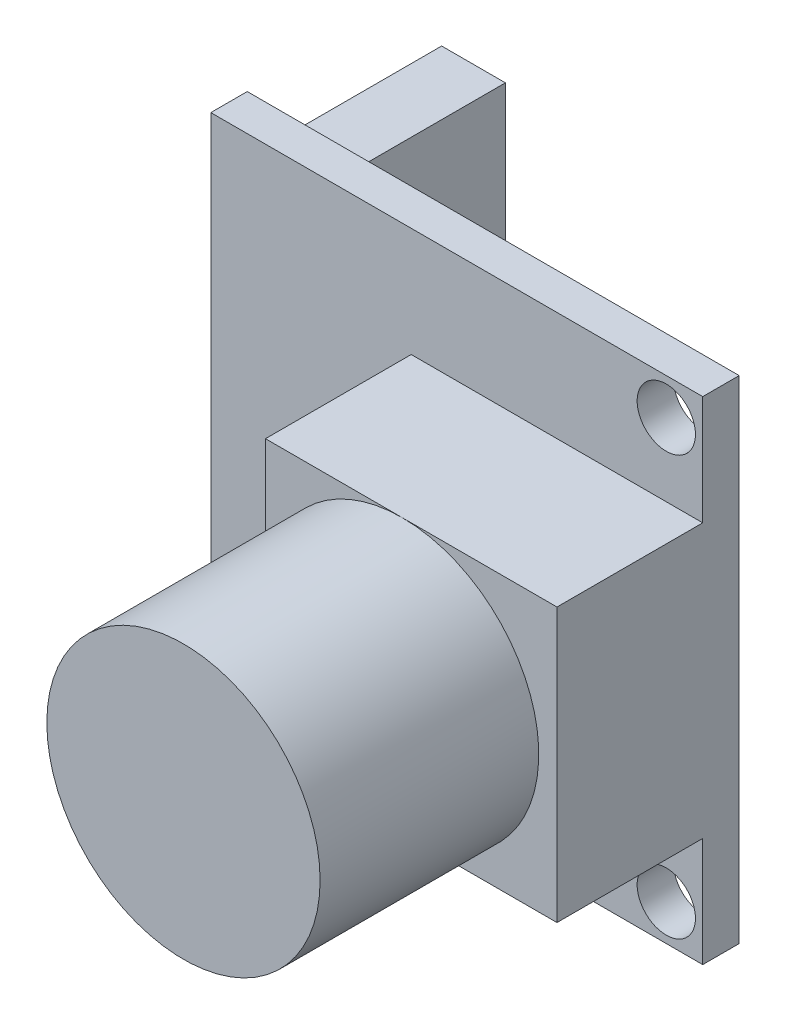
ISO-10303-21;
HEADER;
FILE_DESCRIPTION(('STEP AP214'),'2;1');
FILE_NAME('part.step','',(''),(''),'','','');
FILE_SCHEMA(('AUTOMOTIVE_DESIGN { 1 0 10303 214 1 1 1 1 }'));
ENDSEC;
DATA;
#1=APPLICATION_CONTEXT('core data for automotive mechanical design processes');
#2=APPLICATION_PROTOCOL_DEFINITION('international standard','automotive_design',2000,#1);
#3=PRODUCT_CONTEXT('',#1,'mechanical');
#4=PRODUCT('Part','Part','',(#3));
#5=PRODUCT_RELATED_PRODUCT_CATEGORY('part','',(#4));
#6=PRODUCT_DEFINITION_FORMATION('','',#4);
#7=PRODUCT_DEFINITION_CONTEXT('part definition',#1,'design');
#8=PRODUCT_DEFINITION('design','',#6,#7);
#9=PRODUCT_DEFINITION_SHAPE('','',#8);
#10=(LENGTH_UNIT() NAMED_UNIT(*) SI_UNIT(.MILLI.,.METRE.));
#11=(NAMED_UNIT(*) PLANE_ANGLE_UNIT() SI_UNIT($,.RADIAN.));
#12=(NAMED_UNIT(*) SI_UNIT($,.STERADIAN.) SOLID_ANGLE_UNIT());
#13=UNCERTAINTY_MEASURE_WITH_UNIT(LENGTH_MEASURE(1.E-05),#10,'distance_accuracy_value','');
#14=(GEOMETRIC_REPRESENTATION_CONTEXT(3) GLOBAL_UNCERTAINTY_ASSIGNED_CONTEXT((#13)) GLOBAL_UNIT_ASSIGNED_CONTEXT((#10,
#11,#12)) REPRESENTATION_CONTEXT('',''));
#15=CARTESIAN_POINT('',(0.,0.,0.));
#16=DIRECTION('',(0.,0.,1.));
#17=DIRECTION('',(1.,0.,0.));
#18=AXIS2_PLACEMENT_3D('',#15,#16,#17);
#19=CARTESIAN_POINT('',(0.,0.,0.));
#20=DIRECTION('',(0.,0.,-1.));
#21=DIRECTION('',(-1.,0.,0.));
#22=AXIS2_PLACEMENT_3D('',#19,#20,#21);
#23=PLANE('',#22);
#24=CARTESIAN_POINT('',(266.5,331.5,0.));
#25=DIRECTION('',(0.,0.,1.));
#26=DIRECTION('',(1.,0.,0.));
#27=AXIS2_PLACEMENT_3D('',#24,#25,#26);
#28=CIRCLE('',#27,1.59999999999996);
#29=CARTESIAN_POINT('',(268.1,331.5,0.));
#30=VERTEX_POINT('',#29);
#31=EDGE_CURVE('E211',#30,#30,#28,.T.);
#32=ORIENTED_EDGE('',*,*,#31,.T.);
#33=EDGE_LOOP('',(#32));
#34=FACE_BOUND('',#33,.T.);
#35=DIRECTION('',(0.,1.,0.));
#36=VECTOR('',#35,1.);
#37=CARTESIAN_POINT('',(268.5,333.5,0.));
#38=LINE('',#37,#36);
#39=CARTESIAN_POINT('',(268.5,306.5,0.));
#40=VERTEX_POINT('',#39);
#41=CARTESIAN_POINT('',(268.5,333.5,0.));
#42=VERTEX_POINT('',#41);
#43=EDGE_CURVE('E217',#40,#42,#38,.T.);
#44=ORIENTED_EDGE('',*,*,#43,.F.);
#45=DIRECTION('',(1.,0.,0.));
#46=VECTOR('',#45,1.);
#47=CARTESIAN_POINT('',(268.5,306.5,0.));
#48=LINE('',#47,#46);
#49=CARTESIAN_POINT('',(241.5,306.5,0.));
#50=VERTEX_POINT('',#49);
#51=EDGE_CURVE('E236',#50,#40,#48,.T.);
#52=ORIENTED_EDGE('',*,*,#51,.F.);
#53=DIRECTION('',(0.,-1.,0.));
#54=VECTOR('',#53,1.);
#55=CARTESIAN_POINT('',(241.5,333.5,0.));
#56=LINE('',#55,#54);
#57=CARTESIAN_POINT('',(241.5,333.5,0.));
#58=VERTEX_POINT('',#57);
#59=EDGE_CURVE('E234',#58,#50,#56,.T.);
#60=ORIENTED_EDGE('',*,*,#59,.F.);
#61=DIRECTION('',(-1.,0.,0.));
#62=VECTOR('',#61,1.);
#63=CARTESIAN_POINT('',(268.5,333.5,0.));
#64=LINE('',#63,#62);
#65=EDGE_CURVE('E232',#42,#58,#64,.T.);
#66=ORIENTED_EDGE('',*,*,#65,.F.);
#67=EDGE_LOOP('',(#44,#52,#60,#66));
#68=FACE_BOUND('',#67,.T.);
#69=CARTESIAN_POINT('',(266.5,308.5,0.));
#70=DIRECTION('',(0.,0.,1.));
#71=DIRECTION('',(1.,0.,0.));
#72=AXIS2_PLACEMENT_3D('',#69,#70,#71);
#73=CIRCLE('',#72,1.59999999999996);
#74=CARTESIAN_POINT('',(268.1,308.5,0.));
#75=VERTEX_POINT('',#74);
#76=EDGE_CURVE('E207',#75,#75,#73,.T.);
#77=ORIENTED_EDGE('',*,*,#76,.T.);
#78=EDGE_LOOP('',(#77));
#79=FACE_BOUND('',#78,.T.);
#80=DIRECTION('',(1.,0.,0.));
#81=VECTOR('',#80,1.);
#82=CARTESIAN_POINT('',(242.17,331.,0.));
#83=LINE('',#82,#81);
#84=CARTESIAN_POINT('',(242.17,331.,0.));
#85=VERTEX_POINT('',#84);
#86=CARTESIAN_POINT('',(245.67,331.,0.));
#87=VERTEX_POINT('',#86);
#88=EDGE_CURVE('E330',#85,#87,#83,.T.);
#89=ORIENTED_EDGE('',*,*,#88,.F.);
#90=DIRECTION('',(0.,1.,0.));
#91=VECTOR('',#90,1.);
#92=CARTESIAN_POINT('',(242.17,309.,0.));
#93=LINE('',#92,#91);
#94=CARTESIAN_POINT('',(242.17,309.,0.));
#95=VERTEX_POINT('',#94);
#96=EDGE_CURVE('E165',#95,#85,#93,.T.);
#97=ORIENTED_EDGE('',*,*,#96,.F.);
#98=DIRECTION('',(-1.,0.,0.));
#99=VECTOR('',#98,1.);
#100=CARTESIAN_POINT('',(242.17,309.,0.));
#101=LINE('',#100,#99);
#102=CARTESIAN_POINT('',(245.67,309.,0.));
#103=VERTEX_POINT('',#102);
#104=EDGE_CURVE('E161',#103,#95,#101,.T.);
#105=ORIENTED_EDGE('',*,*,#104,.F.);
#106=DIRECTION('',(0.,-1.,0.));
#107=VECTOR('',#106,1.);
#108=CARTESIAN_POINT('',(245.67,309.,0.));
#109=LINE('',#108,#107);
#110=EDGE_CURVE('E332',#87,#103,#109,.T.);
#111=ORIENTED_EDGE('',*,*,#110,.F.);
#112=EDGE_LOOP('',(#89,#97,#105,#111));
#113=FACE_BOUND('',#112,.T.);
#114=ADVANCED_FACE('F43',(#34,#68,#79,#113),#23,.T.);
#115=CARTESIAN_POINT('',(0.,0.,2.));
#116=DIRECTION('',(0.,0.,-1.));
#117=DIRECTION('',(-1.,0.,0.));
#118=AXIS2_PLACEMENT_3D('',#115,#116,#117);
#119=PLANE('',#118);
#120=CARTESIAN_POINT('',(266.5,308.5,2.));
#121=DIRECTION('',(0.,0.,1.));
#122=DIRECTION('',(1.,0.,0.));
#123=AXIS2_PLACEMENT_3D('',#120,#121,#122);
#124=CIRCLE('',#123,1.59999999999996);
#125=CARTESIAN_POINT('',(268.1,308.5,2.));
#126=VERTEX_POINT('',#125);
#127=EDGE_CURVE('E208',#126,#126,#124,.T.);
#128=ORIENTED_EDGE('',*,*,#127,.F.);
#129=EDGE_LOOP('',(#128));
#130=FACE_BOUND('',#129,.T.);
#131=CARTESIAN_POINT('',(266.5,331.5,2.));
#132=DIRECTION('',(0.,0.,1.));
#133=DIRECTION('',(1.,0.,0.));
#134=AXIS2_PLACEMENT_3D('',#131,#132,#133);
#135=CIRCLE('',#134,1.59999999999996);
#136=CARTESIAN_POINT('',(268.1,331.5,2.));
#137=VERTEX_POINT('',#136);
#138=EDGE_CURVE('E214',#137,#137,#135,.T.);
#139=ORIENTED_EDGE('',*,*,#138,.F.);
#140=EDGE_LOOP('',(#139));
#141=FACE_BOUND('',#140,.T.);
#142=DIRECTION('',(-1.,0.,0.));
#143=VECTOR('',#142,1.);
#144=CARTESIAN_POINT('',(268.5,327.5,2.));
#145=LINE('',#144,#143);
#146=CARTESIAN_POINT('',(268.5,327.5,2.));
#147=VERTEX_POINT('',#146);
#148=CARTESIAN_POINT('',(252.5,327.5,2.));
#149=VERTEX_POINT('',#148);
#150=EDGE_CURVE('E167',#147,#149,#145,.T.);
#151=ORIENTED_EDGE('',*,*,#150,.F.);
#152=DIRECTION('',(0.,1.,0.));
#153=VECTOR('',#152,1.);
#154=CARTESIAN_POINT('',(268.5,333.5,2.));
#155=LINE('',#154,#153);
#156=CARTESIAN_POINT('',(268.5,333.5,2.));
#157=VERTEX_POINT('',#156);
#158=EDGE_CURVE('E223',#147,#157,#155,.T.);
#159=ORIENTED_EDGE('',*,*,#158,.T.);
#160=DIRECTION('',(-1.,0.,0.));
#161=VECTOR('',#160,1.);
#162=CARTESIAN_POINT('',(268.5,333.5,2.));
#163=LINE('',#162,#161);
#164=CARTESIAN_POINT('',(241.5,333.5,2.));
#165=VERTEX_POINT('',#164);
#166=EDGE_CURVE('E222',#157,#165,#163,.T.);
#167=ORIENTED_EDGE('',*,*,#166,.T.);
#168=DIRECTION('',(0.,-1.,0.));
#169=VECTOR('',#168,1.);
#170=CARTESIAN_POINT('',(241.5,333.5,2.));
#171=LINE('',#170,#169);
#172=CARTESIAN_POINT('',(241.5,306.5,2.));
#173=VERTEX_POINT('',#172);
#174=EDGE_CURVE('E225',#165,#173,#171,.T.);
#175=ORIENTED_EDGE('',*,*,#174,.T.);
#176=DIRECTION('',(1.,0.,0.));
#177=VECTOR('',#176,1.);
#178=CARTESIAN_POINT('',(268.5,306.5,2.));
#179=LINE('',#178,#177);
#180=CARTESIAN_POINT('',(268.5,306.5,2.));
#181=VERTEX_POINT('',#180);
#182=EDGE_CURVE('E227',#173,#181,#179,.T.);
#183=ORIENTED_EDGE('',*,*,#182,.T.);
#184=CARTESIAN_POINT('',(268.5,312.5,2.));
#185=VERTEX_POINT('',#184);
#186=EDGE_CURVE('E220',#181,#185,#155,.T.);
#187=ORIENTED_EDGE('',*,*,#186,.T.);
#188=DIRECTION('',(1.,0.,0.));
#189=VECTOR('',#188,1.);
#190=CARTESIAN_POINT('',(268.5,312.5,2.));
#191=LINE('',#190,#189);
#192=CARTESIAN_POINT('',(252.5,312.5,2.));
#193=VERTEX_POINT('',#192);
#194=EDGE_CURVE('E177',#193,#185,#191,.T.);
#195=ORIENTED_EDGE('',*,*,#194,.F.);
#196=DIRECTION('',(0.,-1.,0.));
#197=VECTOR('',#196,1.);
#198=CARTESIAN_POINT('',(252.5,327.5,2.));
#199=LINE('',#198,#197);
#200=EDGE_CURVE('E67',#149,#193,#199,.T.);
#201=ORIENTED_EDGE('',*,*,#200,.F.);
#202=EDGE_LOOP('',(#151,#159,#167,#175,#183,#187,#195,#201));
#203=FACE_BOUND('',#202,.T.);
#204=ADVANCED_FACE('F294',(#130,#141,#203),#119,.F.);
#205=CARTESIAN_POINT('',(268.5,333.5,2.));
#206=DIRECTION('',(-1.,0.,0.));
#207=DIRECTION('',(0.,0.,1.));
#208=AXIS2_PLACEMENT_3D('',#205,#206,#207);
#209=PLANE('',#208);
#210=ORIENTED_EDGE('',*,*,#43,.T.);
#211=DIRECTION('',(0.,0.,-1.));
#212=VECTOR('',#211,1.);
#213=CARTESIAN_POINT('',(268.5,333.5,2.));
#214=LINE('',#213,#212);
#215=EDGE_CURVE('E245',#157,#42,#214,.T.);
#216=ORIENTED_EDGE('',*,*,#215,.F.);
#217=ORIENTED_EDGE('',*,*,#158,.F.);
#218=DIRECTION('',(0.,0.,-1.));
#219=VECTOR('',#218,1.);
#220=CARTESIAN_POINT('',(268.5,327.5,10.));
#221=LINE('',#220,#219);
#222=CARTESIAN_POINT('',(268.5,327.5,10.));
#223=VERTEX_POINT('',#222);
#224=EDGE_CURVE('E201',#223,#147,#221,.T.);
#225=ORIENTED_EDGE('',*,*,#224,.F.);
#226=DIRECTION('',(0.,1.,0.));
#227=VECTOR('',#226,1.);
#228=CARTESIAN_POINT('',(268.5,327.5,10.));
#229=LINE('',#228,#227);
#230=CARTESIAN_POINT('',(268.5,312.5,10.));
#231=VERTEX_POINT('',#230);
#232=EDGE_CURVE('E173',#231,#223,#229,.T.);
#233=ORIENTED_EDGE('',*,*,#232,.F.);
#234=DIRECTION('',(0.,0.,-1.));
#235=VECTOR('',#234,1.);
#236=CARTESIAN_POINT('',(268.5,312.5,10.));
#237=LINE('',#236,#235);
#238=EDGE_CURVE('E188',#231,#185,#237,.T.);
#239=ORIENTED_EDGE('',*,*,#238,.T.);
#240=ORIENTED_EDGE('',*,*,#186,.F.);
#241=DIRECTION('',(0.,0.,-1.));
#242=VECTOR('',#241,1.);
#243=CARTESIAN_POINT('',(268.5,306.5,2.));
#244=LINE('',#243,#242);
#245=EDGE_CURVE('E229',#181,#40,#244,.T.);
#246=ORIENTED_EDGE('',*,*,#245,.T.);
#247=EDGE_LOOP('',(#210,#216,#217,#225,#233,#239,#240,#246));
#248=FACE_BOUND('',#247,.T.);
#249=ADVANCED_FACE('F45',(#248),#209,.F.);
#250=CARTESIAN_POINT('',(268.5,333.5,2.));
#251=DIRECTION('',(0.,-1.,0.));
#252=DIRECTION('',(0.,0.,-1.));
#253=AXIS2_PLACEMENT_3D('',#250,#251,#252);
#254=PLANE('',#253);
#255=ORIENTED_EDGE('',*,*,#65,.T.);
#256=DIRECTION('',(0.,0.,-1.));
#257=VECTOR('',#256,1.);
#258=CARTESIAN_POINT('',(241.5,333.5,2.));
#259=LINE('',#258,#257);
#260=EDGE_CURVE('E243',#165,#58,#259,.T.);
#261=ORIENTED_EDGE('',*,*,#260,.F.);
#262=ORIENTED_EDGE('',*,*,#166,.F.);
#263=ORIENTED_EDGE('',*,*,#215,.T.);
#264=EDGE_LOOP('',(#255,#261,#262,#263));
#265=FACE_BOUND('',#264,.T.);
#266=ADVANCED_FACE('F312',(#265),#254,.F.);
#267=CARTESIAN_POINT('',(241.5,333.5,2.));
#268=DIRECTION('',(1.,0.,0.));
#269=DIRECTION('',(0.,0.,-1.));
#270=AXIS2_PLACEMENT_3D('',#267,#268,#269);
#271=PLANE('',#270);
#272=ORIENTED_EDGE('',*,*,#59,.T.);
#273=DIRECTION('',(0.,0.,-1.));
#274=VECTOR('',#273,1.);
#275=CARTESIAN_POINT('',(241.5,306.5,2.));
#276=LINE('',#275,#274);
#277=EDGE_CURVE('E240',#173,#50,#276,.T.);
#278=ORIENTED_EDGE('',*,*,#277,.F.);
#279=ORIENTED_EDGE('',*,*,#174,.F.);
#280=ORIENTED_EDGE('',*,*,#260,.T.);
#281=EDGE_LOOP('',(#272,#278,#279,#280));
#282=FACE_BOUND('',#281,.T.);
#283=ADVANCED_FACE('F309',(#282),#271,.F.);
#284=CARTESIAN_POINT('',(268.5,306.5,2.));
#285=DIRECTION('',(0.,1.,0.));
#286=DIRECTION('',(0.,0.,1.));
#287=AXIS2_PLACEMENT_3D('',#284,#285,#286);
#288=PLANE('',#287);
#289=ORIENTED_EDGE('',*,*,#51,.T.);
#290=ORIENTED_EDGE('',*,*,#245,.F.);
#291=ORIENTED_EDGE('',*,*,#182,.F.);
#292=ORIENTED_EDGE('',*,*,#277,.T.);
#293=EDGE_LOOP('',(#289,#290,#291,#292));
#294=FACE_BOUND('',#293,.T.);
#295=ADVANCED_FACE('F305',(#294),#288,.F.);
#296=CARTESIAN_POINT('',(266.5,331.5,2.));
#297=DIRECTION('',(0.,0.,-1.));
#298=DIRECTION('',(-1.,0.,0.));
#299=AXIS2_PLACEMENT_3D('',#296,#297,#298);
#300=CYLINDRICAL_SURFACE('',#299,1.59999999999996);
#301=ORIENTED_EDGE('',*,*,#138,.T.);
#302=EDGE_LOOP('',(#301));
#303=FACE_BOUND('',#302,.T.);
#304=ORIENTED_EDGE('',*,*,#31,.F.);
#305=EDGE_LOOP('',(#304));
#306=FACE_BOUND('',#305,.T.);
#307=ADVANCED_FACE('F308',(#303,#306),#300,.F.);
#308=CARTESIAN_POINT('',(266.5,308.5,2.));
#309=DIRECTION('',(0.,0.,-1.));
#310=DIRECTION('',(-1.,0.,0.));
#311=AXIS2_PLACEMENT_3D('',#308,#309,#310);
#312=CYLINDRICAL_SURFACE('',#311,1.59999999999996);
#313=ORIENTED_EDGE('',*,*,#127,.T.);
#314=EDGE_LOOP('',(#313));
#315=FACE_BOUND('',#314,.T.);
#316=ORIENTED_EDGE('',*,*,#76,.F.);
#317=EDGE_LOOP('',(#316));
#318=FACE_BOUND('',#317,.T.);
#319=ADVANCED_FACE('F361',(#315,#318),#312,.F.);
#320=CARTESIAN_POINT('',(268.5,327.5,10.));
#321=DIRECTION('',(0.,-1.,0.));
#322=DIRECTION('',(0.,0.,-1.));
#323=AXIS2_PLACEMENT_3D('',#320,#321,#322);
#324=PLANE('',#323);
#325=DIRECTION('',(-1.,0.,0.));
#326=VECTOR('',#325,1.);
#327=CARTESIAN_POINT('',(268.5,327.5,10.));
#328=LINE('',#327,#326);
#329=CARTESIAN_POINT('',(260.,327.5,10.));
#330=VERTEX_POINT('',#329);
#331=CARTESIAN_POINT('',(252.5,327.5,10.));
#332=VERTEX_POINT('',#331);
#333=EDGE_CURVE('E176',#330,#332,#328,.T.);
#334=ORIENTED_EDGE('',*,*,#333,.F.);
#335=EDGE_CURVE('E178',#223,#330,#328,.T.);
#336=ORIENTED_EDGE('',*,*,#335,.F.);
#337=ORIENTED_EDGE('',*,*,#224,.T.);
#338=ORIENTED_EDGE('',*,*,#150,.T.);
#339=DIRECTION('',(0.,0.,-1.));
#340=VECTOR('',#339,1.);
#341=CARTESIAN_POINT('',(252.5,327.5,10.));
#342=LINE('',#341,#340);
#343=EDGE_CURVE('E198',#332,#149,#342,.T.);
#344=ORIENTED_EDGE('',*,*,#343,.F.);
#345=EDGE_LOOP('',(#334,#336,#337,#338,#344));
#346=FACE_BOUND('',#345,.T.);
#347=ADVANCED_FACE('F274',(#346),#324,.F.);
#348=CARTESIAN_POINT('',(252.5,327.5,10.));
#349=DIRECTION('',(1.,0.,0.));
#350=DIRECTION('',(0.,0.,-1.));
#351=AXIS2_PLACEMENT_3D('',#348,#349,#350);
#352=PLANE('',#351);
#353=DIRECTION('',(0.,-1.,0.));
#354=VECTOR('',#353,1.);
#355=CARTESIAN_POINT('',(252.5,327.5,10.));
#356=LINE('',#355,#354);
#357=CARTESIAN_POINT('',(252.5,320.,10.));
#358=VERTEX_POINT('',#357);
#359=CARTESIAN_POINT('',(252.5,312.5,10.));
#360=VERTEX_POINT('',#359);
#361=EDGE_CURVE('E181',#358,#360,#356,.T.);
#362=ORIENTED_EDGE('',*,*,#361,.F.);
#363=EDGE_CURVE('E182',#332,#358,#356,.T.);
#364=ORIENTED_EDGE('',*,*,#363,.F.);
#365=ORIENTED_EDGE('',*,*,#343,.T.);
#366=ORIENTED_EDGE('',*,*,#200,.T.);
#367=DIRECTION('',(0.,0.,-1.));
#368=VECTOR('',#367,1.);
#369=CARTESIAN_POINT('',(252.5,312.5,10.));
#370=LINE('',#369,#368);
#371=EDGE_CURVE('E195',#360,#193,#370,.T.);
#372=ORIENTED_EDGE('',*,*,#371,.F.);
#373=EDGE_LOOP('',(#362,#364,#365,#366,#372));
#374=FACE_BOUND('',#373,.T.);
#375=ADVANCED_FACE('F267',(#374),#352,.F.);
#376=CARTESIAN_POINT('',(268.5,312.5,10.));
#377=DIRECTION('',(0.,1.,0.));
#378=DIRECTION('',(0.,0.,1.));
#379=AXIS2_PLACEMENT_3D('',#376,#377,#378);
#380=PLANE('',#379);
#381=DIRECTION('',(1.,0.,0.));
#382=VECTOR('',#381,1.);
#383=CARTESIAN_POINT('',(268.5,312.5,10.));
#384=LINE('',#383,#382);
#385=CARTESIAN_POINT('',(260.,312.5,10.));
#386=VERTEX_POINT('',#385);
#387=EDGE_CURVE('E185',#386,#231,#384,.T.);
#388=ORIENTED_EDGE('',*,*,#387,.F.);
#389=EDGE_CURVE('E186',#360,#386,#384,.T.);
#390=ORIENTED_EDGE('',*,*,#389,.F.);
#391=ORIENTED_EDGE('',*,*,#371,.T.);
#392=ORIENTED_EDGE('',*,*,#194,.T.);
#393=ORIENTED_EDGE('',*,*,#238,.F.);
#394=EDGE_LOOP('',(#388,#390,#391,#392,#393));
#395=FACE_BOUND('',#394,.T.);
#396=ADVANCED_FACE('F261',(#395),#380,.F.);
#397=CARTESIAN_POINT('',(0.,0.,10.));
#398=DIRECTION('',(0.,0.,-1.));
#399=DIRECTION('',(-1.,0.,0.));
#400=AXIS2_PLACEMENT_3D('',#397,#398,#399);
#401=PLANE('',#400);
#402=ORIENTED_EDGE('',*,*,#363,.T.);
#403=CARTESIAN_POINT('',(260.,320.,10.));
#404=DIRECTION('',(0.,0.,-1.));
#405=DIRECTION('',(-1.,0.,0.));
#406=AXIS2_PLACEMENT_3D('',#403,#404,#405);
#407=CIRCLE('',#406,7.50000000000001);
#408=EDGE_CURVE('E11',#358,#330,#407,.T.);
#409=ORIENTED_EDGE('',*,*,#408,.T.);
#410=ORIENTED_EDGE('',*,*,#333,.T.);
#411=EDGE_LOOP('',(#402,#409,#410));
#412=FACE_BOUND('',#411,.T.);
#413=ADVANCED_FACE('F277',(#412),#401,.F.);
#414=ORIENTED_EDGE('',*,*,#335,.T.);
#415=EDGE_CURVE('E52',#330,#386,#407,.T.);
#416=ORIENTED_EDGE('',*,*,#415,.T.);
#417=ORIENTED_EDGE('',*,*,#387,.T.);
#418=ORIENTED_EDGE('',*,*,#232,.T.);
#419=EDGE_LOOP('',(#414,#416,#417,#418));
#420=FACE_BOUND('',#419,.T.);
#421=ADVANCED_FACE('F256',(#420),#401,.F.);
#422=ORIENTED_EDGE('',*,*,#389,.T.);
#423=EDGE_CURVE('E47',#386,#358,#407,.T.);
#424=ORIENTED_EDGE('',*,*,#423,.T.);
#425=ORIENTED_EDGE('',*,*,#361,.T.);
#426=EDGE_LOOP('',(#422,#424,#425));
#427=FACE_BOUND('',#426,.T.);
#428=ADVANCED_FACE('F263',(#427),#401,.F.);
#429=CARTESIAN_POINT('',(260.,320.,22.));
#430=DIRECTION('',(0.,0.,1.));
#431=DIRECTION('',(1.,0.,0.));
#432=AXIS2_PLACEMENT_3D('',#429,#430,#431);
#433=PLANE('',#432);
#434=CARTESIAN_POINT('',(260.,320.,22.));
#435=DIRECTION('',(0.,0.,1.));
#436=DIRECTION('',(1.,0.,0.));
#437=AXIS2_PLACEMENT_3D('',#434,#435,#436);
#438=CIRCLE('',#437,7.50000000000001);
#439=CARTESIAN_POINT('',(267.5,320.,22.));
#440=VERTEX_POINT('',#439);
#441=EDGE_CURVE('E204',#440,#440,#438,.T.);
#442=ORIENTED_EDGE('',*,*,#441,.T.);
#443=EDGE_LOOP('',(#442));
#444=FACE_BOUND('',#443,.T.);
#445=ADVANCED_FACE('F280',(#444),#433,.T.);
#446=CARTESIAN_POINT('',(260.,320.,22.));
#447=DIRECTION('',(0.,0.,-1.));
#448=DIRECTION('',(-1.,0.,0.));
#449=AXIS2_PLACEMENT_3D('',#446,#447,#448);
#450=CYLINDRICAL_SURFACE('',#449,7.50000000000001);
#451=ORIENTED_EDGE('',*,*,#441,.F.);
#452=EDGE_LOOP('',(#451));
#453=FACE_BOUND('',#452,.T.);
#454=ORIENTED_EDGE('',*,*,#408,.F.);
#455=ORIENTED_EDGE('',*,*,#423,.F.);
#456=ORIENTED_EDGE('',*,*,#415,.F.);
#457=EDGE_LOOP('',(#454,#455,#456));
#458=FACE_BOUND('',#457,.T.);
#459=ADVANCED_FACE('F278',(#453,#458),#450,.T.);
#460=CARTESIAN_POINT('',(242.17,309.,-10.));
#461=DIRECTION('',(1.,0.,0.));
#462=DIRECTION('',(0.,0.,-1.));
#463=AXIS2_PLACEMENT_3D('',#460,#461,#462);
#464=PLANE('',#463);
#465=ORIENTED_EDGE('',*,*,#96,.T.);
#466=DIRECTION('',(0.,0.,1.));
#467=VECTOR('',#466,1.);
#468=CARTESIAN_POINT('',(242.17,331.,-10.));
#469=LINE('',#468,#467);
#470=CARTESIAN_POINT('',(242.17,331.,-10.));
#471=VERTEX_POINT('',#470);
#472=EDGE_CURVE('E146',#471,#85,#469,.T.);
#473=ORIENTED_EDGE('',*,*,#472,.F.);
#474=DIRECTION('',(0.,1.,0.));
#475=VECTOR('',#474,1.);
#476=CARTESIAN_POINT('',(242.17,309.,-10.));
#477=LINE('',#476,#475);
#478=CARTESIAN_POINT('',(242.17,309.,-10.));
#479=VERTEX_POINT('',#478);
#480=EDGE_CURVE('E153',#479,#471,#477,.T.);
#481=ORIENTED_EDGE('',*,*,#480,.F.);
#482=DIRECTION('',(0.,0.,1.));
#483=VECTOR('',#482,1.);
#484=CARTESIAN_POINT('',(242.17,309.,-10.));
#485=LINE('',#484,#483);
#486=EDGE_CURVE('E339',#479,#95,#485,.T.);
#487=ORIENTED_EDGE('',*,*,#486,.T.);
#488=EDGE_LOOP('',(#465,#473,#481,#487));
#489=FACE_BOUND('',#488,.T.);
#490=ADVANCED_FACE('F163',(#489),#464,.F.);
#491=CARTESIAN_POINT('',(242.17,331.,-10.));
#492=DIRECTION('',(0.,-1.,0.));
#493=DIRECTION('',(0.,0.,-1.));
#494=AXIS2_PLACEMENT_3D('',#491,#492,#493);
#495=PLANE('',#494);
#496=ORIENTED_EDGE('',*,*,#88,.T.);
#497=DIRECTION('',(0.,0.,1.));
#498=VECTOR('',#497,1.);
#499=CARTESIAN_POINT('',(245.67,331.,-10.));
#500=LINE('',#499,#498);
#501=CARTESIAN_POINT('',(245.67,331.,-10.));
#502=VERTEX_POINT('',#501);
#503=EDGE_CURVE('E149',#502,#87,#500,.T.);
#504=ORIENTED_EDGE('',*,*,#503,.F.);
#505=DIRECTION('',(1.,0.,0.));
#506=VECTOR('',#505,1.);
#507=CARTESIAN_POINT('',(242.17,331.,-10.));
#508=LINE('',#507,#506);
#509=EDGE_CURVE('E142',#471,#502,#508,.T.);
#510=ORIENTED_EDGE('',*,*,#509,.F.);
#511=ORIENTED_EDGE('',*,*,#472,.T.);
#512=EDGE_LOOP('',(#496,#504,#510,#511));
#513=FACE_BOUND('',#512,.T.);
#514=ADVANCED_FACE('F144',(#513),#495,.F.);
#515=CARTESIAN_POINT('',(245.67,309.,-10.));
#516=DIRECTION('',(-1.,0.,0.));
#517=DIRECTION('',(0.,0.,1.));
#518=AXIS2_PLACEMENT_3D('',#515,#516,#517);
#519=PLANE('',#518);
#520=ORIENTED_EDGE('',*,*,#110,.T.);
#521=DIRECTION('',(0.,0.,1.));
#522=VECTOR('',#521,1.);
#523=CARTESIAN_POINT('',(245.67,309.,-10.));
#524=LINE('',#523,#522);
#525=CARTESIAN_POINT('',(245.67,309.,-10.));
#526=VERTEX_POINT('',#525);
#527=EDGE_CURVE('E59',#526,#103,#524,.T.);
#528=ORIENTED_EDGE('',*,*,#527,.F.);
#529=DIRECTION('',(0.,-1.,0.));
#530=VECTOR('',#529,1.);
#531=CARTESIAN_POINT('',(245.67,309.,-10.));
#532=LINE('',#531,#530);
#533=EDGE_CURVE('E152',#502,#526,#532,.T.);
#534=ORIENTED_EDGE('',*,*,#533,.F.);
#535=ORIENTED_EDGE('',*,*,#503,.T.);
#536=EDGE_LOOP('',(#520,#528,#534,#535));
#537=FACE_BOUND('',#536,.T.);
#538=ADVANCED_FACE('F342',(#537),#519,.F.);
#539=CARTESIAN_POINT('',(242.17,309.,-10.));
#540=DIRECTION('',(0.,1.,0.));
#541=DIRECTION('',(0.,0.,1.));
#542=AXIS2_PLACEMENT_3D('',#539,#540,#541);
#543=PLANE('',#542);
#544=ORIENTED_EDGE('',*,*,#104,.T.);
#545=ORIENTED_EDGE('',*,*,#486,.F.);
#546=DIRECTION('',(-1.,0.,0.));
#547=VECTOR('',#546,1.);
#548=CARTESIAN_POINT('',(242.17,309.,-10.));
#549=LINE('',#548,#547);
#550=EDGE_CURVE('E157',#526,#479,#549,.T.);
#551=ORIENTED_EDGE('',*,*,#550,.F.);
#552=ORIENTED_EDGE('',*,*,#527,.T.);
#553=EDGE_LOOP('',(#544,#545,#551,#552));
#554=FACE_BOUND('',#553,.T.);
#555=ADVANCED_FACE('F343',(#554),#543,.F.);
#556=CARTESIAN_POINT('',(0.,0.,-10.));
#557=DIRECTION('',(0.,0.,-1.));
#558=DIRECTION('',(-1.,0.,0.));
#559=AXIS2_PLACEMENT_3D('',#556,#557,#558);
#560=PLANE('',#559);
#561=ORIENTED_EDGE('',*,*,#480,.T.);
#562=ORIENTED_EDGE('',*,*,#509,.T.);
#563=ORIENTED_EDGE('',*,*,#533,.T.);
#564=ORIENTED_EDGE('',*,*,#550,.T.);
#565=EDGE_LOOP('',(#561,#562,#563,#564));
#566=FACE_BOUND('',#565,.T.);
#567=ADVANCED_FACE('F156',(#566),#560,.T.);
#568=CLOSED_SHELL('',(#114,#204,#249,#266,#283,#295,#307,#319,#347,#375,#396,#413,#421,#428,
#445,#459,#490,#514,#538,#555,#567));
#569=MANIFOLD_SOLID_BREP('B2',#568);
#570=ADVANCED_BREP_SHAPE_REPRESENTATION('',(#18,#569),#14);
#571=SHAPE_DEFINITION_REPRESENTATION(#9,#570);
ENDSEC;
END-ISO-10303-21;
